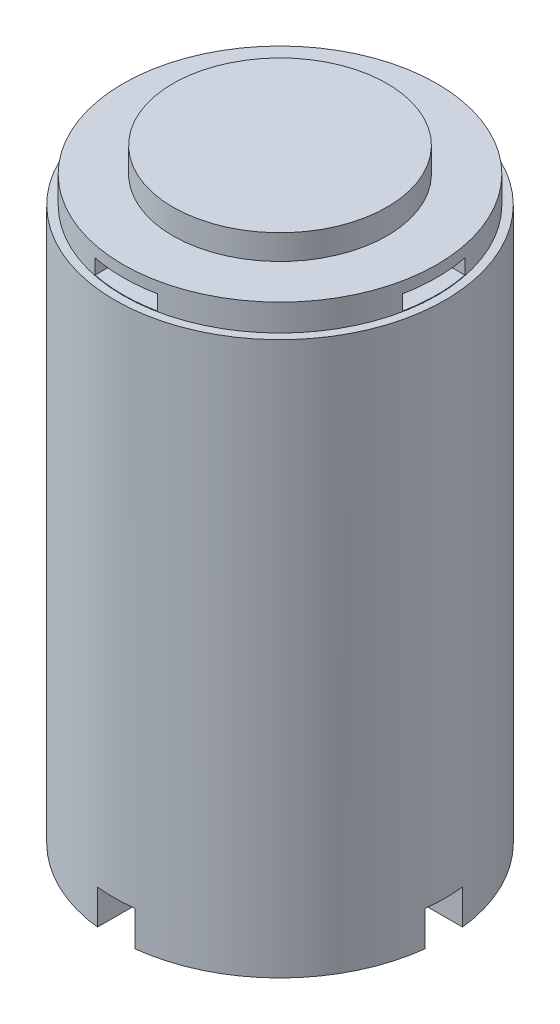
ISO-10303-21;
HEADER;
FILE_DESCRIPTION(('STEP AP214'),'2;1');
FILE_NAME('part.step','',(''),(''),'','','');
FILE_SCHEMA(('AUTOMOTIVE_DESIGN { 1 0 10303 214 1 1 1 1 }'));
ENDSEC;
DATA;
#1=APPLICATION_CONTEXT('core data for automotive mechanical design processes');
#2=APPLICATION_PROTOCOL_DEFINITION('international standard','automotive_design',2000,#1);
#3=PRODUCT_CONTEXT('',#1,'mechanical');
#4=PRODUCT('Part','Part','',(#3));
#5=PRODUCT_RELATED_PRODUCT_CATEGORY('part','',(#4));
#6=PRODUCT_DEFINITION_FORMATION('','',#4);
#7=PRODUCT_DEFINITION_CONTEXT('part definition',#1,'design');
#8=PRODUCT_DEFINITION('design','',#6,#7);
#9=PRODUCT_DEFINITION_SHAPE('','',#8);
#10=(LENGTH_UNIT() NAMED_UNIT(*) SI_UNIT(.MILLI.,.METRE.));
#11=(NAMED_UNIT(*) PLANE_ANGLE_UNIT() SI_UNIT($,.RADIAN.));
#12=(NAMED_UNIT(*) SI_UNIT($,.STERADIAN.) SOLID_ANGLE_UNIT());
#13=UNCERTAINTY_MEASURE_WITH_UNIT(LENGTH_MEASURE(1.E-05),#10,'distance_accuracy_value','');
#14=(GEOMETRIC_REPRESENTATION_CONTEXT(3) GLOBAL_UNCERTAINTY_ASSIGNED_CONTEXT((#13)) GLOBAL_UNIT_ASSIGNED_CONTEXT((#10,
#11,#12)) REPRESENTATION_CONTEXT('',''));
#15=CARTESIAN_POINT('',(0.,0.,0.));
#16=DIRECTION('',(0.,0.,1.));
#17=DIRECTION('',(1.,0.,0.));
#18=AXIS2_PLACEMENT_3D('',#15,#16,#17);
#19=CARTESIAN_POINT('',(1682.75,5594.35,-317.5));
#20=DIRECTION('',(0.,0.,-1.));
#21=DIRECTION('',(-1.,0.,0.));
#22=AXIS2_PLACEMENT_3D('',#19,#20,#21);
#23=PLANE('',#22);
#24=DIRECTION('',(-1.,0.,0.));
#25=VECTOR('',#24,1.);
#26=CARTESIAN_POINT('',(1682.75,5594.35,-317.5));
#27=LINE('',#26,#25);
#28=CARTESIAN_POINT('',(-317.499999999999,5594.35,-317.5));
#29=VERTEX_POINT('',#28);
#30=CARTESIAN_POINT('',(-1568.38572742805,5594.35,-317.5));
#31=VERTEX_POINT('',#30);
#32=EDGE_CURVE('E400',#29,#31,#27,.T.);
#33=ORIENTED_EDGE('',*,*,#32,.F.);
#34=DIRECTION('',(0.,1.,0.));
#35=VECTOR('',#34,1.);
#36=CARTESIAN_POINT('',(-317.500000000001,5594.35,-317.5));
#37=LINE('',#36,#35);
#38=CARTESIAN_POINT('',(-317.500000000001,5746.75,-317.5));
#39=VERTEX_POINT('',#38);
#40=EDGE_CURVE('E397',#29,#39,#37,.T.);
#41=ORIENTED_EDGE('',*,*,#40,.T.);
#42=DIRECTION('',(-1.,0.,0.));
#43=VECTOR('',#42,1.);
#44=CARTESIAN_POINT('',(1682.75,5746.75,-317.5));
#45=LINE('',#44,#43);
#46=CARTESIAN_POINT('',(-1568.38572742805,5746.75,-317.5));
#47=VERTEX_POINT('',#46);
#48=EDGE_CURVE('E405',#39,#47,#45,.T.);
#49=ORIENTED_EDGE('',*,*,#48,.T.);
#50=DIRECTION('',(0.,-1.,0.));
#51=VECTOR('',#50,1.);
#52=CARTESIAN_POINT('',(-1568.38572742805,5861.05,-317.5));
#53=LINE('',#52,#51);
#54=EDGE_CURVE('E495',#31,#47,#53,.F.);
#55=ORIENTED_EDGE('',*,*,#54,.F.);
#56=EDGE_LOOP('',(#33,#41,#49,#55));
#57=FACE_BOUND('',#56,.T.);
#58=ADVANCED_FACE('F42',(#57),#23,.F.);
#59=CARTESIAN_POINT('',(1682.75,5594.35,317.5));
#60=DIRECTION('',(0.,0.,1.));
#61=DIRECTION('',(1.,0.,0.));
#62=AXIS2_PLACEMENT_3D('',#59,#60,#61);
#63=PLANE('',#62);
#64=DIRECTION('',(-1.,0.,0.));
#65=VECTOR('',#64,1.);
#66=CARTESIAN_POINT('',(1682.75,5746.75,317.5));
#67=LINE('',#66,#65);
#68=CARTESIAN_POINT('',(-317.499999999999,5746.75,317.5));
#69=VERTEX_POINT('',#68);
#70=CARTESIAN_POINT('',(-1568.38572742805,5746.75,317.5));
#71=VERTEX_POINT('',#70);
#72=EDGE_CURVE('E409',#69,#71,#67,.T.);
#73=ORIENTED_EDGE('',*,*,#72,.F.);
#74=DIRECTION('',(0.,-1.,0.));
#75=VECTOR('',#74,1.);
#76=CARTESIAN_POINT('',(-317.499999999999,5594.35,317.5));
#77=LINE('',#76,#75);
#78=CARTESIAN_POINT('',(-317.499999999999,5594.35,317.5));
#79=VERTEX_POINT('',#78);
#80=EDGE_CURVE('E394',#69,#79,#77,.T.);
#81=ORIENTED_EDGE('',*,*,#80,.T.);
#82=DIRECTION('',(-1.,0.,0.));
#83=VECTOR('',#82,1.);
#84=CARTESIAN_POINT('',(1682.75,5594.35,317.5));
#85=LINE('',#84,#83);
#86=CARTESIAN_POINT('',(-1568.38572742805,5594.35,317.5));
#87=VERTEX_POINT('',#86);
#88=EDGE_CURVE('E413',#79,#87,#85,.T.);
#89=ORIENTED_EDGE('',*,*,#88,.T.);
#90=DIRECTION('',(0.,-1.,0.));
#91=VECTOR('',#90,1.);
#92=CARTESIAN_POINT('',(-1568.38572742805,5861.05,317.5));
#93=LINE('',#92,#91);
#94=EDGE_CURVE('E488',#71,#87,#93,.T.);
#95=ORIENTED_EDGE('',*,*,#94,.F.);
#96=EDGE_LOOP('',(#73,#81,#89,#95));
#97=FACE_BOUND('',#96,.T.);
#98=ADVANCED_FACE('F537',(#97),#63,.F.);
#99=CARTESIAN_POINT('',(1682.75,0.,-190.5));
#100=DIRECTION('',(0.,0.,-1.));
#101=DIRECTION('',(0.,1.,0.));
#102=AXIS2_PLACEMENT_3D('',#99,#100,#101);
#103=PLANE('',#102);
#104=DIRECTION('',(-1.,0.,0.));
#105=VECTOR('',#104,1.);
#106=CARTESIAN_POINT('',(0.,0.,-190.5));
#107=LINE('',#106,#105);
#108=CARTESIAN_POINT('',(-190.500000000001,0.,-190.5));
#109=VERTEX_POINT('',#108);
#110=CARTESIAN_POINT('',(-1294.15430301027,0.,-190.5));
#111=VERTEX_POINT('',#110);
#112=EDGE_CURVE('E57',#109,#111,#107,.T.);
#113=ORIENTED_EDGE('',*,*,#112,.F.);
#114=DIRECTION('',(0.,1.,0.));
#115=VECTOR('',#114,1.);
#116=CARTESIAN_POINT('',(-190.500000000001,6.82324567217547E-13,-190.5));
#117=LINE('',#116,#115);
#118=CARTESIAN_POINT('',(-190.500000000001,304.8,-190.5));
#119=VERTEX_POINT('',#118);
#120=EDGE_CURVE('E438',#109,#119,#117,.T.);
#121=ORIENTED_EDGE('',*,*,#120,.T.);
#122=DIRECTION('',(-1.,0.,0.));
#123=VECTOR('',#122,1.);
#124=CARTESIAN_POINT('',(1682.75,304.8,-190.5));
#125=LINE('',#124,#123);
#126=CARTESIAN_POINT('',(-1671.93220930156,304.8,-190.5));
#127=VERTEX_POINT('',#126);
#128=EDGE_CURVE('E446',#119,#127,#125,.T.);
#129=ORIENTED_EDGE('',*,*,#128,.T.);
#130=DIRECTION('',(0.,-1.,0.));
#131=VECTOR('',#130,1.);
#132=CARTESIAN_POINT('',(-1671.93220930156,5588.,-190.499999999998));
#133=LINE('',#132,#131);
#134=CARTESIAN_POINT('',(-1671.93220930156,-50.8,-190.5));
#135=VERTEX_POINT('',#134);
#136=EDGE_CURVE('E454',#135,#127,#133,.F.);
#137=ORIENTED_EDGE('',*,*,#136,.F.);
#138=DIRECTION('',(-1.,0.,0.));
#139=VECTOR('',#138,1.);
#140=CARTESIAN_POINT('',(-1671.93220930156,-50.8,-190.5));
#141=LINE('',#140,#139);
#142=CARTESIAN_POINT('',(-1294.15430301027,-50.8,-190.5));
#143=VERTEX_POINT('',#142);
#144=EDGE_CURVE('E279',#143,#135,#141,.T.);
#145=ORIENTED_EDGE('',*,*,#144,.F.);
#146=DIRECTION('',(0.,1.,0.));
#147=VECTOR('',#146,1.);
#148=CARTESIAN_POINT('',(-1294.15430301027,-50.8,-190.5));
#149=LINE('',#148,#147);
#150=EDGE_CURVE('E317',#143,#111,#149,.T.);
#151=ORIENTED_EDGE('',*,*,#150,.T.);
#152=EDGE_LOOP('',(#113,#121,#129,#137,#145,#151));
#153=FACE_BOUND('',#152,.T.);
#154=ADVANCED_FACE('F560',(#153),#103,.F.);
#155=CARTESIAN_POINT('',(1682.75,0.,190.5));
#156=DIRECTION('',(0.,0.,1.));
#157=DIRECTION('',(0.,-1.,0.));
#158=AXIS2_PLACEMENT_3D('',#155,#156,#157);
#159=PLANE('',#158);
#160=DIRECTION('',(-1.,0.,0.));
#161=VECTOR('',#160,1.);
#162=CARTESIAN_POINT('',(1682.75,304.8,190.5));
#163=LINE('',#162,#161);
#164=CARTESIAN_POINT('',(-190.499999999999,304.8,190.5));
#165=VERTEX_POINT('',#164);
#166=CARTESIAN_POINT('',(-1671.93220930156,304.8,190.5));
#167=VERTEX_POINT('',#166);
#168=EDGE_CURVE('E441',#165,#167,#163,.T.);
#169=ORIENTED_EDGE('',*,*,#168,.F.);
#170=DIRECTION('',(0.,-1.,0.));
#171=VECTOR('',#170,1.);
#172=CARTESIAN_POINT('',(-190.499999999999,6.82324567217542E-13,190.5));
#173=LINE('',#172,#171);
#174=CARTESIAN_POINT('',(-190.499999999999,0.,190.5));
#175=VERTEX_POINT('',#174);
#176=EDGE_CURVE('E483',#165,#175,#173,.T.);
#177=ORIENTED_EDGE('',*,*,#176,.T.);
#178=DIRECTION('',(1.,0.,0.));
#179=VECTOR('',#178,1.);
#180=CARTESIAN_POINT('',(1682.75,0.,190.5));
#181=LINE('',#180,#179);
#182=CARTESIAN_POINT('',(-1294.15430301027,0.,190.5));
#183=VERTEX_POINT('',#182);
#184=EDGE_CURVE('E65',#183,#175,#181,.T.);
#185=ORIENTED_EDGE('',*,*,#184,.F.);
#186=DIRECTION('',(0.,1.,0.));
#187=VECTOR('',#186,1.);
#188=CARTESIAN_POINT('',(-1294.15430301027,-50.8,190.500000000001));
#189=LINE('',#188,#187);
#190=CARTESIAN_POINT('',(-1294.15430301027,-50.8,190.500000000001));
#191=VERTEX_POINT('',#190);
#192=EDGE_CURVE('E328',#191,#183,#189,.T.);
#193=ORIENTED_EDGE('',*,*,#192,.F.);
#194=DIRECTION('',(1.,0.,0.));
#195=VECTOR('',#194,1.);
#196=CARTESIAN_POINT('',(-1671.93220930156,-50.8,190.5));
#197=LINE('',#196,#195);
#198=CARTESIAN_POINT('',(-1671.93220930156,-50.8,190.5));
#199=VERTEX_POINT('',#198);
#200=EDGE_CURVE('E312',#199,#191,#197,.T.);
#201=ORIENTED_EDGE('',*,*,#200,.F.);
#202=DIRECTION('',(0.,-1.,0.));
#203=VECTOR('',#202,1.);
#204=CARTESIAN_POINT('',(-1671.93220930156,5588.,190.499999999998));
#205=LINE('',#204,#203);
#206=EDGE_CURVE('E452',#167,#199,#205,.T.);
#207=ORIENTED_EDGE('',*,*,#206,.F.);
#208=EDGE_LOOP('',(#169,#177,#185,#193,#201,#207));
#209=FACE_BOUND('',#208,.T.);
#210=ADVANCED_FACE('F589',(#209),#159,.F.);
#211=CARTESIAN_POINT('',(0.,5588.,0.));
#212=DIRECTION('',(0.,-1.,0.));
#213=DIRECTION('',(0.,0.,-1.));
#214=AXIS2_PLACEMENT_3D('',#211,#212,#213);
#215=CYLINDRICAL_SURFACE('',#214,1682.75);
#216=CARTESIAN_POINT('',(0.,5588.,0.));
#217=DIRECTION('',(0.,1.,0.));
#218=DIRECTION('',(0.,0.,1.));
#219=AXIS2_PLACEMENT_3D('',#216,#217,#218);
#220=CIRCLE('',#219,1682.75);
#221=CARTESIAN_POINT('',(0.,5588.,1682.75));
#222=VERTEX_POINT('',#221);
#223=EDGE_CURVE('E469',#222,#222,#220,.T.);
#224=ORIENTED_EDGE('',*,*,#223,.F.);
#225=EDGE_LOOP('',(#224));
#226=FACE_BOUND('',#225,.T.);
#227=ORIENTED_EDGE('',*,*,#206,.T.);
#228=CARTESIAN_POINT('',(0.,-50.8,0.));
#229=DIRECTION('',(0.,-1.,0.));
#230=DIRECTION('',(0.,0.,-1.));
#231=AXIS2_PLACEMENT_3D('',#228,#229,#230);
#232=CIRCLE('',#231,1682.75);
#233=CARTESIAN_POINT('',(-190.499999999994,-50.8,1671.93220930156));
#234=VERTEX_POINT('',#233);
#235=EDGE_CURVE('E309',#234,#199,#232,.T.);
#236=ORIENTED_EDGE('',*,*,#235,.F.);
#237=DIRECTION('',(0.,-1.,0.));
#238=VECTOR('',#237,1.);
#239=CARTESIAN_POINT('',(-190.499999999992,5588.,1671.93220930156));
#240=LINE('',#239,#238);
#241=CARTESIAN_POINT('',(-190.499999999994,304.8,1671.93220930156));
#242=VERTEX_POINT('',#241);
#243=EDGE_CURVE('E432',#234,#242,#240,.F.);
#244=ORIENTED_EDGE('',*,*,#243,.T.);
#245=CARTESIAN_POINT('',(0.,304.8,0.));
#246=DIRECTION('',(0.,1.,0.));
#247=DIRECTION('',(1.,0.,0.));
#248=AXIS2_PLACEMENT_3D('',#245,#246,#247);
#249=CIRCLE('',#248,1682.75);
#250=CARTESIAN_POINT('',(190.500000000006,304.8,1671.93220930156));
#251=VERTEX_POINT('',#250);
#252=EDGE_CURVE('E426',#242,#251,#249,.T.);
#253=ORIENTED_EDGE('',*,*,#252,.T.);
#254=DIRECTION('',(0.,-1.,0.));
#255=VECTOR('',#254,1.);
#256=CARTESIAN_POINT('',(190.500000000004,5588.,1671.93220930156));
#257=LINE('',#256,#255);
#258=CARTESIAN_POINT('',(190.500000000006,-50.8,1671.93220930156));
#259=VERTEX_POINT('',#258);
#260=EDGE_CURVE('E424',#251,#259,#257,.T.);
#261=ORIENTED_EDGE('',*,*,#260,.T.);
#262=CARTESIAN_POINT('',(0.,-50.8,0.));
#263=DIRECTION('',(0.,-1.,0.));
#264=DIRECTION('',(0.,0.,-1.));
#265=AXIS2_PLACEMENT_3D('',#262,#263,#264);
#266=CIRCLE('',#265,1682.75);
#267=CARTESIAN_POINT('',(1671.93220930156,-50.8,190.5));
#268=VERTEX_POINT('',#267);
#269=EDGE_CURVE('E299',#268,#259,#266,.T.);
#270=ORIENTED_EDGE('',*,*,#269,.F.);
#271=DIRECTION('',(0.,-1.,0.));
#272=VECTOR('',#271,1.);
#273=CARTESIAN_POINT('',(1671.93220930156,5588.,190.499999999998));
#274=LINE('',#273,#272);
#275=CARTESIAN_POINT('',(1671.93220930156,304.8,190.5));
#276=VERTEX_POINT('',#275);
#277=EDGE_CURVE('E445',#268,#276,#274,.F.);
#278=ORIENTED_EDGE('',*,*,#277,.T.);
#279=CARTESIAN_POINT('',(0.,304.8,0.));
#280=DIRECTION('',(0.,1.,0.));
#281=DIRECTION('',(0.,0.,1.));
#282=AXIS2_PLACEMENT_3D('',#279,#280,#281);
#283=CIRCLE('',#282,1682.75);
#284=CARTESIAN_POINT('',(1671.93220930156,304.8,-190.5));
#285=VERTEX_POINT('',#284);
#286=EDGE_CURVE('E479',#276,#285,#283,.T.);
#287=ORIENTED_EDGE('',*,*,#286,.T.);
#288=DIRECTION('',(0.,-1.,0.));
#289=VECTOR('',#288,1.);
#290=CARTESIAN_POINT('',(1671.93220930156,5588.,-190.499999999998));
#291=LINE('',#290,#289);
#292=CARTESIAN_POINT('',(1671.93220930156,-50.8,-190.5));
#293=VERTEX_POINT('',#292);
#294=EDGE_CURVE('E456',#285,#293,#291,.T.);
#295=ORIENTED_EDGE('',*,*,#294,.T.);
#296=CARTESIAN_POINT('',(0.,-50.8,0.));
#297=DIRECTION('',(0.,-1.,0.));
#298=DIRECTION('',(0.,0.,-1.));
#299=AXIS2_PLACEMENT_3D('',#296,#297,#298);
#300=CIRCLE('',#299,1682.75);
#301=CARTESIAN_POINT('',(190.499999999994,-50.8,-1671.93220930156));
#302=VERTEX_POINT('',#301);
#303=EDGE_CURVE('E289',#302,#293,#300,.T.);
#304=ORIENTED_EDGE('',*,*,#303,.F.);
#305=DIRECTION('',(0.,-1.,0.));
#306=VECTOR('',#305,1.);
#307=CARTESIAN_POINT('',(190.499999999992,5588.,-1671.93220930156));
#308=LINE('',#307,#306);
#309=CARTESIAN_POINT('',(190.499999999994,304.8,-1671.93220930156));
#310=VERTEX_POINT('',#309);
#311=EDGE_CURVE('E404',#302,#310,#308,.F.);
#312=ORIENTED_EDGE('',*,*,#311,.T.);
#313=CARTESIAN_POINT('',(-190.500000000006,304.8,-1671.93220930156));
#314=VERTEX_POINT('',#313);
#315=EDGE_CURVE('E262',#310,#314,#249,.T.);
#316=ORIENTED_EDGE('',*,*,#315,.T.);
#317=DIRECTION('',(0.,-1.,0.));
#318=VECTOR('',#317,1.);
#319=CARTESIAN_POINT('',(-190.500000000004,5588.,-1671.93220930156));
#320=LINE('',#319,#318);
#321=CARTESIAN_POINT('',(-190.500000000006,-50.8,-1671.93220930156));
#322=VERTEX_POINT('',#321);
#323=EDGE_CURVE('E255',#314,#322,#320,.T.);
#324=ORIENTED_EDGE('',*,*,#323,.T.);
#325=CARTESIAN_POINT('',(0.,-50.8,0.));
#326=DIRECTION('',(0.,-1.,0.));
#327=DIRECTION('',(0.,0.,-1.));
#328=AXIS2_PLACEMENT_3D('',#325,#326,#327);
#329=CIRCLE('',#328,1682.75);
#330=EDGE_CURVE('E259',#135,#322,#329,.T.);
#331=ORIENTED_EDGE('',*,*,#330,.F.);
#332=ORIENTED_EDGE('',*,*,#136,.T.);
#333=EDGE_CURVE('E476',#127,#167,#283,.T.);
#334=ORIENTED_EDGE('',*,*,#333,.T.);
#335=EDGE_LOOP('',(#227,#236,#244,#253,#261,#270,#278,#287,#295,#304,#312,#316,#324,#331,#332,#334));
#336=FACE_BOUND('',#335,.T.);
#337=ADVANCED_FACE('F44',(#226,#336),#215,.T.);
#338=CARTESIAN_POINT('',(0.,5588.,0.));
#339=DIRECTION('',(0.,1.,0.));
#340=DIRECTION('',(0.,0.,1.));
#341=AXIS2_PLACEMENT_3D('',#338,#339,#340);
#342=PLANE('',#341);
#343=CARTESIAN_POINT('',(0.,5588.,0.));
#344=DIRECTION('',(0.,1.,0.));
#345=DIRECTION('',(0.,0.,1.));
#346=AXIS2_PLACEMENT_3D('',#343,#344,#345);
#347=CIRCLE('',#346,1600.2);
#348=CARTESIAN_POINT('',(0.,5588.,1600.2));
#349=VERTEX_POINT('',#348);
#350=EDGE_CURVE('E466',#349,#349,#347,.T.);
#351=ORIENTED_EDGE('',*,*,#350,.F.);
#352=EDGE_LOOP('',(#351));
#353=FACE_BOUND('',#352,.T.);
#354=ORIENTED_EDGE('',*,*,#223,.T.);
#355=EDGE_LOOP('',(#354));
#356=FACE_BOUND('',#355,.T.);
#357=ADVANCED_FACE('F719',(#353,#356),#342,.T.);
#358=CARTESIAN_POINT('',(0.,5861.05,0.));
#359=DIRECTION('',(0.,-1.,0.));
#360=DIRECTION('',(0.,0.,-1.));
#361=AXIS2_PLACEMENT_3D('',#358,#359,#360);
#362=CYLINDRICAL_SURFACE('',#361,1600.2);
#363=CARTESIAN_POINT('',(0.,5594.35,0.));
#364=DIRECTION('',(0.,-1.,0.));
#365=DIRECTION('',(-1.,0.,0.));
#366=AXIS2_PLACEMENT_3D('',#363,#364,#365);
#367=CIRCLE('',#366,1600.2);
#368=CARTESIAN_POINT('',(317.500000000005,5594.35,1568.38572742804));
#369=VERTEX_POINT('',#368);
#370=CARTESIAN_POINT('',(-317.499999999994,5594.35,1568.38572742805));
#371=VERTEX_POINT('',#370);
#372=EDGE_CURVE('E355',#369,#371,#367,.T.);
#373=ORIENTED_EDGE('',*,*,#372,.T.);
#374=DIRECTION('',(0.,-1.,0.));
#375=VECTOR('',#374,1.);
#376=CARTESIAN_POINT('',(-317.499999999994,5861.05,1568.38572742805));
#377=LINE('',#376,#375);
#378=CARTESIAN_POINT('',(-317.499999999994,5746.75,1568.38572742805));
#379=VERTEX_POINT('',#378);
#380=EDGE_CURVE('E382',#371,#379,#377,.F.);
#381=ORIENTED_EDGE('',*,*,#380,.T.);
#382=CARTESIAN_POINT('',(0.,5746.75,0.));
#383=DIRECTION('',(0.,1.,0.));
#384=DIRECTION('',(1.,0.,0.));
#385=AXIS2_PLACEMENT_3D('',#382,#383,#384);
#386=CIRCLE('',#385,1600.2);
#387=CARTESIAN_POINT('',(317.500000000006,5746.75,1568.38572742804));
#388=VERTEX_POINT('',#387);
#389=EDGE_CURVE('E375',#379,#388,#386,.T.);
#390=ORIENTED_EDGE('',*,*,#389,.T.);
#391=DIRECTION('',(0.,-1.,0.));
#392=VECTOR('',#391,1.);
#393=CARTESIAN_POINT('',(317.500000000006,5861.05,1568.38572742804));
#394=LINE('',#393,#392);
#395=EDGE_CURVE('E372',#388,#369,#394,.T.);
#396=ORIENTED_EDGE('',*,*,#395,.T.);
#397=EDGE_LOOP('',(#373,#381,#390,#396));
#398=FACE_BOUND('',#397,.T.);
#399=CARTESIAN_POINT('',(317.499999999994,5746.75,-1568.38572742805));
#400=VERTEX_POINT('',#399);
#401=CARTESIAN_POINT('',(-317.500000000005,5746.75,-1568.38572742804));
#402=VERTEX_POINT('',#401);
#403=EDGE_CURVE('E379',#400,#402,#386,.T.);
#404=ORIENTED_EDGE('',*,*,#403,.T.);
#405=DIRECTION('',(0.,-1.,0.));
#406=VECTOR('',#405,1.);
#407=CARTESIAN_POINT('',(-317.500000000006,5861.05,-1568.38572742804));
#408=LINE('',#407,#406);
#409=CARTESIAN_POINT('',(-317.500000000005,5594.35,-1568.38572742804));
#410=VERTEX_POINT('',#409);
#411=EDGE_CURVE('E385',#402,#410,#408,.T.);
#412=ORIENTED_EDGE('',*,*,#411,.T.);
#413=CARTESIAN_POINT('',(317.499999999994,5594.35,-1568.38572742805));
#414=VERTEX_POINT('',#413);
#415=EDGE_CURVE('E358',#410,#414,#367,.T.);
#416=ORIENTED_EDGE('',*,*,#415,.T.);
#417=DIRECTION('',(0.,-1.,0.));
#418=VECTOR('',#417,1.);
#419=CARTESIAN_POINT('',(317.499999999994,5861.05,-1568.38572742805));
#420=LINE('',#419,#418);
#421=EDGE_CURVE('E369',#414,#400,#420,.F.);
#422=ORIENTED_EDGE('',*,*,#421,.T.);
#423=EDGE_LOOP('',(#404,#412,#416,#422));
#424=FACE_BOUND('',#423,.T.);
#425=CARTESIAN_POINT('',(0.,5746.75,0.));
#426=DIRECTION('',(0.,1.,0.));
#427=DIRECTION('',(0.,0.,1.));
#428=AXIS2_PLACEMENT_3D('',#425,#426,#427);
#429=CIRCLE('',#428,1600.2);
#430=CARTESIAN_POINT('',(1568.38572742805,5746.75,317.5));
#431=VERTEX_POINT('',#430);
#432=CARTESIAN_POINT('',(1568.38572742805,5746.75,-317.5));
#433=VERTEX_POINT('',#432);
#434=EDGE_CURVE('E50',#431,#433,#429,.T.);
#435=ORIENTED_EDGE('',*,*,#434,.T.);
#436=DIRECTION('',(0.,-1.,0.));
#437=VECTOR('',#436,1.);
#438=CARTESIAN_POINT('',(1568.38572742805,5861.05,-317.5));
#439=LINE('',#438,#437);
#440=CARTESIAN_POINT('',(1568.38572742805,5594.35,-317.5));
#441=VERTEX_POINT('',#440);
#442=EDGE_CURVE('E11',#433,#441,#439,.T.);
#443=ORIENTED_EDGE('',*,*,#442,.T.);
#444=CARTESIAN_POINT('',(0.,5594.35,0.));
#445=DIRECTION('',(0.,-1.,0.));
#446=DIRECTION('',(0.,0.,-1.));
#447=AXIS2_PLACEMENT_3D('',#444,#445,#446);
#448=CIRCLE('',#447,1600.2);
#449=CARTESIAN_POINT('',(1568.38572742805,5594.35,317.5));
#450=VERTEX_POINT('',#449);
#451=EDGE_CURVE('E489',#441,#450,#448,.T.);
#452=ORIENTED_EDGE('',*,*,#451,.T.);
#453=DIRECTION('',(0.,-1.,0.));
#454=VECTOR('',#453,1.);
#455=CARTESIAN_POINT('',(1568.38572742805,5861.05,317.5));
#456=LINE('',#455,#454);
#457=EDGE_CURVE('E497',#450,#431,#456,.F.);
#458=ORIENTED_EDGE('',*,*,#457,.T.);
#459=EDGE_LOOP('',(#435,#443,#452,#458));
#460=FACE_BOUND('',#459,.T.);
#461=EDGE_CURVE('E485',#87,#31,#448,.T.);
#462=ORIENTED_EDGE('',*,*,#461,.T.);
#463=ORIENTED_EDGE('',*,*,#54,.T.);
#464=EDGE_CURVE('E492',#47,#71,#429,.T.);
#465=ORIENTED_EDGE('',*,*,#464,.T.);
#466=ORIENTED_EDGE('',*,*,#94,.T.);
#467=EDGE_LOOP('',(#462,#463,#465,#466));
#468=FACE_BOUND('',#467,.T.);
#469=CARTESIAN_POINT('',(0.,5861.05,0.));
#470=DIRECTION('',(0.,1.,0.));
#471=DIRECTION('',(0.,0.,1.));
#472=AXIS2_PLACEMENT_3D('',#469,#470,#471);
#473=CIRCLE('',#472,1600.2);
#474=CARTESIAN_POINT('',(0.,5861.05,1600.2));
#475=VERTEX_POINT('',#474);
#476=EDGE_CURVE('E461',#475,#475,#473,.T.);
#477=ORIENTED_EDGE('',*,*,#476,.F.);
#478=EDGE_LOOP('',(#477));
#479=FACE_BOUND('',#478,.T.);
#480=ORIENTED_EDGE('',*,*,#350,.T.);
#481=EDGE_LOOP('',(#480));
#482=FACE_BOUND('',#481,.T.);
#483=ADVANCED_FACE('F503',(#398,#424,#460,#468,#479,#482),#362,.T.);
#484=CARTESIAN_POINT('',(0.,5861.05,0.));
#485=DIRECTION('',(0.,1.,0.));
#486=DIRECTION('',(0.,0.,1.));
#487=AXIS2_PLACEMENT_3D('',#484,#485,#486);
#488=PLANE('',#487);
#489=CARTESIAN_POINT('',(0.,5861.05,0.));
#490=DIRECTION('',(0.,1.,0.));
#491=DIRECTION('',(0.,0.,1.));
#492=AXIS2_PLACEMENT_3D('',#489,#490,#491);
#493=CIRCLE('',#492,1092.2);
#494=CARTESIAN_POINT('',(0.,5861.05,1092.2));
#495=VERTEX_POINT('',#494);
#496=EDGE_CURVE('E462',#495,#495,#493,.T.);
#497=ORIENTED_EDGE('',*,*,#496,.F.);
#498=EDGE_LOOP('',(#497));
#499=FACE_BOUND('',#498,.T.);
#500=ORIENTED_EDGE('',*,*,#476,.T.);
#501=EDGE_LOOP('',(#500));
#502=FACE_BOUND('',#501,.T.);
#503=ADVANCED_FACE('F903',(#499,#502),#488,.T.);
#504=CARTESIAN_POINT('',(0.,6115.05,0.));
#505=DIRECTION('',(0.,-1.,0.));
#506=DIRECTION('',(0.,0.,-1.));
#507=AXIS2_PLACEMENT_3D('',#504,#505,#506);
#508=CYLINDRICAL_SURFACE('',#507,1092.2);
#509=CARTESIAN_POINT('',(0.,6115.05,0.));
#510=DIRECTION('',(0.,1.,0.));
#511=DIRECTION('',(0.,0.,1.));
#512=AXIS2_PLACEMENT_3D('',#509,#510,#511);
#513=CIRCLE('',#512,1092.2);
#514=CARTESIAN_POINT('',(0.,6115.05,1092.2));
#515=VERTEX_POINT('',#514);
#516=EDGE_CURVE('E458',#515,#515,#513,.T.);
#517=ORIENTED_EDGE('',*,*,#516,.F.);
#518=EDGE_LOOP('',(#517));
#519=FACE_BOUND('',#518,.T.);
#520=ORIENTED_EDGE('',*,*,#496,.T.);
#521=EDGE_LOOP('',(#520));
#522=FACE_BOUND('',#521,.T.);
#523=ADVANCED_FACE('F893',(#519,#522),#508,.T.);
#524=CARTESIAN_POINT('',(0.,6115.05,0.));
#525=DIRECTION('',(0.,1.,0.));
#526=DIRECTION('',(0.,0.,1.));
#527=AXIS2_PLACEMENT_3D('',#524,#525,#526);
#528=PLANE('',#527);
#529=ORIENTED_EDGE('',*,*,#516,.T.);
#530=EDGE_LOOP('',(#529));
#531=FACE_BOUND('',#530,.T.);
#532=ADVANCED_FACE('F885',(#531),#528,.T.);
#533=CARTESIAN_POINT('',(1682.75,304.8,-190.5));
#534=DIRECTION('',(0.,1.,0.));
#535=DIRECTION('',(0.,0.,1.));
#536=AXIS2_PLACEMENT_3D('',#533,#534,#535);
#537=PLANE('',#536);
#538=CARTESIAN_POINT('',(190.500000000001,304.8,190.5));
#539=VERTEX_POINT('',#538);
#540=EDGE_CURVE('E447',#276,#539,#163,.T.);
#541=ORIENTED_EDGE('',*,*,#540,.T.);
#542=DIRECTION('',(0.,0.,1.));
#543=VECTOR('',#542,1.);
#544=CARTESIAN_POINT('',(190.499999999994,304.8,-1682.75));
#545=LINE('',#544,#543);
#546=EDGE_CURVE('E418',#539,#251,#545,.T.);
#547=ORIENTED_EDGE('',*,*,#546,.T.);
#548=ORIENTED_EDGE('',*,*,#252,.F.);
#549=DIRECTION('',(0.,0.,1.));
#550=VECTOR('',#549,1.);
#551=CARTESIAN_POINT('',(-190.500000000006,304.8,-1682.75));
#552=LINE('',#551,#550);
#553=EDGE_CURVE('E429',#165,#242,#552,.T.);
#554=ORIENTED_EDGE('',*,*,#553,.F.);
#555=ORIENTED_EDGE('',*,*,#168,.T.);
#556=ORIENTED_EDGE('',*,*,#333,.F.);
#557=ORIENTED_EDGE('',*,*,#128,.F.);
#558=EDGE_CURVE('E430',#314,#119,#552,.T.);
#559=ORIENTED_EDGE('',*,*,#558,.F.);
#560=ORIENTED_EDGE('',*,*,#315,.F.);
#561=CARTESIAN_POINT('',(190.499999999999,304.8,-190.5));
#562=VERTEX_POINT('',#561);
#563=EDGE_CURVE('E419',#310,#562,#545,.T.);
#564=ORIENTED_EDGE('',*,*,#563,.T.);
#565=EDGE_CURVE('E442',#285,#562,#125,.T.);
#566=ORIENTED_EDGE('',*,*,#565,.F.);
#567=ORIENTED_EDGE('',*,*,#286,.F.);
#568=EDGE_LOOP('',(#541,#547,#548,#554,#555,#556,#557,#559,#560,#564,#566,#567));
#569=FACE_BOUND('',#568,.T.);
#570=ADVANCED_FACE('F606',(#569),#537,.F.);
#571=ORIENTED_EDGE('',*,*,#565,.T.);
#572=DIRECTION('',(0.,-1.,0.));
#573=VECTOR('',#572,1.);
#574=CARTESIAN_POINT('',(190.5,-5.43546689139398E-13,-190.5));
#575=LINE('',#574,#573);
#576=CARTESIAN_POINT('',(190.5,0.,-190.5));
#577=VERTEX_POINT('',#576);
#578=EDGE_CURVE('E264',#562,#577,#575,.T.);
#579=ORIENTED_EDGE('',*,*,#578,.T.);
#580=DIRECTION('',(-1.,0.,0.));
#581=VECTOR('',#580,1.);
#582=CARTESIAN_POINT('',(1682.75,0.,-190.5));
#583=LINE('',#582,#581);
#584=CARTESIAN_POINT('',(1294.15430301027,0.,-190.5));
#585=VERTEX_POINT('',#584);
#586=EDGE_CURVE('E346',#585,#577,#583,.T.);
#587=ORIENTED_EDGE('',*,*,#586,.F.);
#588=DIRECTION('',(0.,1.,0.));
#589=VECTOR('',#588,1.);
#590=CARTESIAN_POINT('',(1294.15430301027,-50.8,-190.5));
#591=LINE('',#590,#589);
#592=CARTESIAN_POINT('',(1294.15430301027,-50.8,-190.5));
#593=VERTEX_POINT('',#592);
#594=EDGE_CURVE('E339',#593,#585,#591,.T.);
#595=ORIENTED_EDGE('',*,*,#594,.F.);
#596=DIRECTION('',(-1.,0.,0.));
#597=VECTOR('',#596,1.);
#598=CARTESIAN_POINT('',(1671.93220930156,-50.8,-190.5));
#599=LINE('',#598,#597);
#600=EDGE_CURVE('E292',#293,#593,#599,.T.);
#601=ORIENTED_EDGE('',*,*,#600,.F.);
#602=ORIENTED_EDGE('',*,*,#294,.F.);
#603=EDGE_LOOP('',(#571,#579,#587,#595,#601,#602));
#604=FACE_BOUND('',#603,.T.);
#605=ADVANCED_FACE('F586',(#604),#103,.F.);
#606=DIRECTION('',(1.,0.,0.));
#607=VECTOR('',#606,1.);
#608=CARTESIAN_POINT('',(0.,0.,190.5));
#609=LINE('',#608,#607);
#610=CARTESIAN_POINT('',(190.500000000001,0.,190.5));
#611=VERTEX_POINT('',#610);
#612=CARTESIAN_POINT('',(1294.15430301027,0.,190.5));
#613=VERTEX_POINT('',#612);
#614=EDGE_CURVE('E465',#611,#613,#609,.T.);
#615=ORIENTED_EDGE('',*,*,#614,.F.);
#616=DIRECTION('',(0.,1.,0.));
#617=VECTOR('',#616,1.);
#618=CARTESIAN_POINT('',(190.500000000001,-5.43546689139401E-13,190.5));
#619=LINE('',#618,#617);
#620=EDGE_CURVE('E480',#611,#539,#619,.T.);
#621=ORIENTED_EDGE('',*,*,#620,.T.);
#622=ORIENTED_EDGE('',*,*,#540,.F.);
#623=ORIENTED_EDGE('',*,*,#277,.F.);
#624=DIRECTION('',(1.,0.,0.));
#625=VECTOR('',#624,1.);
#626=CARTESIAN_POINT('',(1294.15430301027,-50.8,190.5));
#627=LINE('',#626,#625);
#628=CARTESIAN_POINT('',(1294.15430301027,-50.8,190.5));
#629=VERTEX_POINT('',#628);
#630=EDGE_CURVE('E296',#629,#268,#627,.T.);
#631=ORIENTED_EDGE('',*,*,#630,.F.);
#632=DIRECTION('',(0.,1.,0.));
#633=VECTOR('',#632,1.);
#634=CARTESIAN_POINT('',(1294.15430301027,-50.8,190.5));
#635=LINE('',#634,#633);
#636=EDGE_CURVE('E336',#629,#613,#635,.T.);
#637=ORIENTED_EDGE('',*,*,#636,.T.);
#638=EDGE_LOOP('',(#615,#621,#622,#623,#631,#637));
#639=FACE_BOUND('',#638,.T.);
#640=ADVANCED_FACE('F579',(#639),#159,.F.);
#641=CARTESIAN_POINT('',(190.499999999994,0.,-1682.75));
#642=DIRECTION('',(1.,0.,0.));
#643=DIRECTION('',(0.,-1.,0.));
#644=AXIS2_PLACEMENT_3D('',#641,#642,#643);
#645=PLANE('',#644);
#646=DIRECTION('',(0.,0.,-1.));
#647=VECTOR('',#646,1.);
#648=CARTESIAN_POINT('',(190.499999999994,0.,-1682.75));
#649=LINE('',#648,#647);
#650=CARTESIAN_POINT('',(190.500000000005,0.,1294.15430301027));
#651=VERTEX_POINT('',#650);
#652=EDGE_CURVE('E352',#651,#611,#649,.T.);
#653=ORIENTED_EDGE('',*,*,#652,.F.);
#654=DIRECTION('',(0.,1.,0.));
#655=VECTOR('',#654,1.);
#656=CARTESIAN_POINT('',(190.500000000006,-50.8,1294.15430301027));
#657=LINE('',#656,#655);
#658=CARTESIAN_POINT('',(190.500000000006,-50.8,1294.15430301027));
#659=VERTEX_POINT('',#658);
#660=EDGE_CURVE('E333',#659,#651,#657,.T.);
#661=ORIENTED_EDGE('',*,*,#660,.F.);
#662=DIRECTION('',(0.,0.,-1.));
#663=VECTOR('',#662,1.);
#664=CARTESIAN_POINT('',(190.500000000006,-50.8,1294.15430301027));
#665=LINE('',#664,#663);
#666=EDGE_CURVE('E302',#259,#659,#665,.T.);
#667=ORIENTED_EDGE('',*,*,#666,.F.);
#668=ORIENTED_EDGE('',*,*,#260,.F.);
#669=ORIENTED_EDGE('',*,*,#546,.F.);
#670=ORIENTED_EDGE('',*,*,#620,.F.);
#671=EDGE_LOOP('',(#653,#661,#667,#668,#669,#670));
#672=FACE_BOUND('',#671,.T.);
#673=ADVANCED_FACE('F572',(#672),#645,.F.);
#674=CARTESIAN_POINT('',(-190.500000000006,0.,-1682.75));
#675=DIRECTION('',(-1.,0.,0.));
#676=DIRECTION('',(0.,1.,0.));
#677=AXIS2_PLACEMENT_3D('',#674,#675,#676);
#678=PLANE('',#677);
#679=ORIENTED_EDGE('',*,*,#553,.T.);
#680=ORIENTED_EDGE('',*,*,#243,.F.);
#681=DIRECTION('',(0.,0.,1.));
#682=VECTOR('',#681,1.);
#683=CARTESIAN_POINT('',(-190.499999999994,-50.8,1671.93220930156));
#684=LINE('',#683,#682);
#685=CARTESIAN_POINT('',(-190.499999999994,-50.8,1294.15430301027));
#686=VERTEX_POINT('',#685);
#687=EDGE_CURVE('E306',#686,#234,#684,.T.);
#688=ORIENTED_EDGE('',*,*,#687,.F.);
#689=DIRECTION('',(0.,1.,0.));
#690=VECTOR('',#689,1.);
#691=CARTESIAN_POINT('',(-190.499999999994,-50.8,1294.15430301027));
#692=LINE('',#691,#690);
#693=CARTESIAN_POINT('',(-190.499999999996,0.,1294.15430301027));
#694=VERTEX_POINT('',#693);
#695=EDGE_CURVE('E330',#686,#694,#692,.T.);
#696=ORIENTED_EDGE('',*,*,#695,.T.);
#697=DIRECTION('',(0.,0.,1.));
#698=VECTOR('',#697,1.);
#699=CARTESIAN_POINT('',(-190.5,0.,6.65127195049617E-13));
#700=LINE('',#699,#698);
#701=EDGE_CURVE('E265',#175,#694,#700,.T.);
#702=ORIENTED_EDGE('',*,*,#701,.F.);
#703=ORIENTED_EDGE('',*,*,#176,.F.);
#704=EDGE_LOOP('',(#679,#680,#688,#696,#702,#703));
#705=FACE_BOUND('',#704,.T.);
#706=ADVANCED_FACE('F576',(#705),#678,.F.);
#707=DIRECTION('',(0.,0.,1.));
#708=VECTOR('',#707,1.);
#709=CARTESIAN_POINT('',(-190.500000000006,0.,-1682.75));
#710=LINE('',#709,#708);
#711=CARTESIAN_POINT('',(-190.500000000005,0.,-1294.15430301027));
#712=VERTEX_POINT('',#711);
#713=EDGE_CURVE('E349',#712,#109,#710,.T.);
#714=ORIENTED_EDGE('',*,*,#713,.F.);
#715=DIRECTION('',(0.,1.,0.));
#716=VECTOR('',#715,1.);
#717=CARTESIAN_POINT('',(-190.500000000005,-50.8,-1294.15430301027));
#718=LINE('',#717,#716);
#719=CARTESIAN_POINT('',(-190.500000000005,-50.8,-1294.15430301027));
#720=VERTEX_POINT('',#719);
#721=EDGE_CURVE('E271',#720,#712,#718,.T.);
#722=ORIENTED_EDGE('',*,*,#721,.F.);
#723=DIRECTION('',(0.,0.,1.));
#724=VECTOR('',#723,1.);
#725=CARTESIAN_POINT('',(-190.500000000006,-50.8,-1671.93220930156));
#726=LINE('',#725,#724);
#727=EDGE_CURVE('E268',#322,#720,#726,.T.);
#728=ORIENTED_EDGE('',*,*,#727,.F.);
#729=ORIENTED_EDGE('',*,*,#323,.F.);
#730=ORIENTED_EDGE('',*,*,#558,.T.);
#731=ORIENTED_EDGE('',*,*,#120,.F.);
#732=EDGE_LOOP('',(#714,#722,#728,#729,#730,#731));
#733=FACE_BOUND('',#732,.T.);
#734=ADVANCED_FACE('F269',(#733),#678,.F.);
#735=ORIENTED_EDGE('',*,*,#563,.F.);
#736=ORIENTED_EDGE('',*,*,#311,.F.);
#737=DIRECTION('',(0.,0.,-1.));
#738=VECTOR('',#737,1.);
#739=CARTESIAN_POINT('',(190.499999999994,-50.8,-1671.93220930156));
#740=LINE('',#739,#738);
#741=CARTESIAN_POINT('',(190.499999999996,-50.8,-1294.15430301027));
#742=VERTEX_POINT('',#741);
#743=EDGE_CURVE('E286',#742,#302,#740,.T.);
#744=ORIENTED_EDGE('',*,*,#743,.F.);
#745=DIRECTION('',(0.,1.,0.));
#746=VECTOR('',#745,1.);
#747=CARTESIAN_POINT('',(190.499999999996,-50.8,-1294.15430301027));
#748=LINE('',#747,#746);
#749=CARTESIAN_POINT('',(190.499999999996,0.,-1294.15430301027));
#750=VERTEX_POINT('',#749);
#751=EDGE_CURVE('E342',#742,#750,#748,.T.);
#752=ORIENTED_EDGE('',*,*,#751,.T.);
#753=DIRECTION('',(0.,0.,-1.));
#754=VECTOR('',#753,1.);
#755=CARTESIAN_POINT('',(190.5,0.,-6.65127195049617E-13));
#756=LINE('',#755,#754);
#757=EDGE_CURVE('E422',#577,#750,#756,.T.);
#758=ORIENTED_EDGE('',*,*,#757,.F.);
#759=ORIENTED_EDGE('',*,*,#578,.F.);
#760=EDGE_LOOP('',(#735,#736,#744,#752,#758,#759));
#761=FACE_BOUND('',#760,.T.);
#762=ADVANCED_FACE('F567',(#761),#645,.F.);
#763=CARTESIAN_POINT('',(317.499999999999,5746.75,-317.5));
#764=VERTEX_POINT('',#763);
#765=EDGE_CURVE('E401',#433,#764,#45,.T.);
#766=ORIENTED_EDGE('',*,*,#765,.T.);
#767=DIRECTION('',(0.,-1.,0.));
#768=VECTOR('',#767,1.);
#769=CARTESIAN_POINT('',(317.499999999999,5594.35,-317.5));
#770=LINE('',#769,#768);
#771=CARTESIAN_POINT('',(317.499999999999,5594.35,-317.5));
#772=VERTEX_POINT('',#771);
#773=EDGE_CURVE('E391',#764,#772,#770,.T.);
#774=ORIENTED_EDGE('',*,*,#773,.T.);
#775=EDGE_CURVE('E414',#441,#772,#27,.T.);
#776=ORIENTED_EDGE('',*,*,#775,.F.);
#777=ORIENTED_EDGE('',*,*,#442,.F.);
#778=EDGE_LOOP('',(#766,#774,#776,#777));
#779=FACE_BOUND('',#778,.T.);
#780=ADVANCED_FACE('F510',(#779),#23,.F.);
#781=CARTESIAN_POINT('',(1682.75,5746.75,-317.5));
#782=DIRECTION('',(0.,1.,0.));
#783=DIRECTION('',(0.,0.,1.));
#784=AXIS2_PLACEMENT_3D('',#781,#782,#783);
#785=PLANE('',#784);
#786=CARTESIAN_POINT('',(317.500000000001,5746.75,317.5));
#787=VERTEX_POINT('',#786);
#788=EDGE_CURVE('E406',#431,#787,#67,.T.);
#789=ORIENTED_EDGE('',*,*,#788,.T.);
#790=DIRECTION('',(0.,0.,1.));
#791=VECTOR('',#790,1.);
#792=CARTESIAN_POINT('',(317.499999999994,5746.75,-1682.75));
#793=LINE('',#792,#791);
#794=EDGE_CURVE('E365',#787,#388,#793,.T.);
#795=ORIENTED_EDGE('',*,*,#794,.T.);
#796=ORIENTED_EDGE('',*,*,#389,.F.);
#797=DIRECTION('',(0.,0.,1.));
#798=VECTOR('',#797,1.);
#799=CARTESIAN_POINT('',(-317.500000000006,5746.75,-1682.75));
#800=LINE('',#799,#798);
#801=EDGE_CURVE('E378',#69,#379,#800,.T.);
#802=ORIENTED_EDGE('',*,*,#801,.F.);
#803=ORIENTED_EDGE('',*,*,#72,.T.);
#804=ORIENTED_EDGE('',*,*,#464,.F.);
#805=ORIENTED_EDGE('',*,*,#48,.F.);
#806=EDGE_CURVE('E380',#402,#39,#800,.T.);
#807=ORIENTED_EDGE('',*,*,#806,.F.);
#808=ORIENTED_EDGE('',*,*,#403,.F.);
#809=EDGE_CURVE('E366',#400,#764,#793,.T.);
#810=ORIENTED_EDGE('',*,*,#809,.T.);
#811=ORIENTED_EDGE('',*,*,#765,.F.);
#812=ORIENTED_EDGE('',*,*,#434,.F.);
#813=EDGE_LOOP('',(#789,#795,#796,#802,#803,#804,#805,#807,#808,#810,#811,#812));
#814=FACE_BOUND('',#813,.T.);
#815=ADVANCED_FACE('F516',(#814),#785,.F.);
#816=CARTESIAN_POINT('',(317.5,5594.35,317.5));
#817=VERTEX_POINT('',#816);
#818=EDGE_CURVE('E410',#450,#817,#85,.T.);
#819=ORIENTED_EDGE('',*,*,#818,.T.);
#820=DIRECTION('',(0.,1.,0.));
#821=VECTOR('',#820,1.);
#822=CARTESIAN_POINT('',(317.500000000001,5594.35,317.5));
#823=LINE('',#822,#821);
#824=EDGE_CURVE('E388',#817,#787,#823,.T.);
#825=ORIENTED_EDGE('',*,*,#824,.T.);
#826=ORIENTED_EDGE('',*,*,#788,.F.);
#827=ORIENTED_EDGE('',*,*,#457,.F.);
#828=EDGE_LOOP('',(#819,#825,#826,#827));
#829=FACE_BOUND('',#828,.T.);
#830=ADVANCED_FACE('F550',(#829),#63,.F.);
#831=CARTESIAN_POINT('',(1682.75,5594.35,-317.5));
#832=DIRECTION('',(0.,-1.,0.));
#833=DIRECTION('',(0.,0.,-1.));
#834=AXIS2_PLACEMENT_3D('',#831,#832,#833);
#835=PLANE('',#834);
#836=ORIENTED_EDGE('',*,*,#775,.T.);
#837=DIRECTION('',(0.,0.,1.));
#838=VECTOR('',#837,1.);
#839=CARTESIAN_POINT('',(317.499999999994,5594.35,-1682.75));
#840=LINE('',#839,#838);
#841=EDGE_CURVE('E363',#414,#772,#840,.T.);
#842=ORIENTED_EDGE('',*,*,#841,.F.);
#843=ORIENTED_EDGE('',*,*,#415,.F.);
#844=DIRECTION('',(0.,0.,1.));
#845=VECTOR('',#844,1.);
#846=CARTESIAN_POINT('',(-317.500000000006,5594.35,-1682.75));
#847=LINE('',#846,#845);
#848=EDGE_CURVE('E359',#410,#29,#847,.T.);
#849=ORIENTED_EDGE('',*,*,#848,.T.);
#850=ORIENTED_EDGE('',*,*,#32,.T.);
#851=ORIENTED_EDGE('',*,*,#461,.F.);
#852=ORIENTED_EDGE('',*,*,#88,.F.);
#853=EDGE_CURVE('E362',#79,#371,#847,.T.);
#854=ORIENTED_EDGE('',*,*,#853,.T.);
#855=ORIENTED_EDGE('',*,*,#372,.F.);
#856=EDGE_CURVE('E361',#817,#369,#840,.T.);
#857=ORIENTED_EDGE('',*,*,#856,.F.);
#858=ORIENTED_EDGE('',*,*,#818,.F.);
#859=ORIENTED_EDGE('',*,*,#451,.F.);
#860=EDGE_LOOP('',(#836,#842,#843,#849,#850,#851,#852,#854,#855,#857,#858,#859));
#861=FACE_BOUND('',#860,.T.);
#862=ADVANCED_FACE('F507',(#861),#835,.F.);
#863=CARTESIAN_POINT('',(317.499999999994,5594.35,-1682.75));
#864=DIRECTION('',(1.,0.,0.));
#865=DIRECTION('',(0.,0.,-1.));
#866=AXIS2_PLACEMENT_3D('',#863,#864,#865);
#867=PLANE('',#866);
#868=ORIENTED_EDGE('',*,*,#856,.T.);
#869=ORIENTED_EDGE('',*,*,#395,.F.);
#870=ORIENTED_EDGE('',*,*,#794,.F.);
#871=ORIENTED_EDGE('',*,*,#824,.F.);
#872=EDGE_LOOP('',(#868,#869,#870,#871));
#873=FACE_BOUND('',#872,.T.);
#874=ADVANCED_FACE('F547',(#873),#867,.F.);
#875=CARTESIAN_POINT('',(-317.500000000006,5594.35,-1682.75));
#876=DIRECTION('',(-1.,0.,0.));
#877=DIRECTION('',(0.,0.,1.));
#878=AXIS2_PLACEMENT_3D('',#875,#876,#877);
#879=PLANE('',#878);
#880=ORIENTED_EDGE('',*,*,#801,.T.);
#881=ORIENTED_EDGE('',*,*,#380,.F.);
#882=ORIENTED_EDGE('',*,*,#853,.F.);
#883=ORIENTED_EDGE('',*,*,#80,.F.);
#884=EDGE_LOOP('',(#880,#881,#882,#883));
#885=FACE_BOUND('',#884,.T.);
#886=ADVANCED_FACE('F540',(#885),#879,.F.);
#887=ORIENTED_EDGE('',*,*,#848,.F.);
#888=ORIENTED_EDGE('',*,*,#411,.F.);
#889=ORIENTED_EDGE('',*,*,#806,.T.);
#890=ORIENTED_EDGE('',*,*,#40,.F.);
#891=EDGE_LOOP('',(#887,#888,#889,#890));
#892=FACE_BOUND('',#891,.T.);
#893=ADVANCED_FACE('F525',(#892),#879,.F.);
#894=ORIENTED_EDGE('',*,*,#809,.F.);
#895=ORIENTED_EDGE('',*,*,#421,.F.);
#896=ORIENTED_EDGE('',*,*,#841,.T.);
#897=ORIENTED_EDGE('',*,*,#773,.F.);
#898=EDGE_LOOP('',(#894,#895,#896,#897));
#899=FACE_BOUND('',#898,.T.);
#900=ADVANCED_FACE('F513',(#899),#867,.F.);
#901=CARTESIAN_POINT('',(0.,0.,0.));
#902=DIRECTION('',(0.,-1.,0.));
#903=DIRECTION('',(0.,0.,-1.));
#904=AXIS2_PLACEMENT_3D('',#901,#902,#903);
#905=PLANE('',#904);
#906=ORIENTED_EDGE('',*,*,#652,.T.);
#907=ORIENTED_EDGE('',*,*,#614,.T.);
#908=CARTESIAN_POINT('',(0.,0.,0.));
#909=DIRECTION('',(0.,-1.,0.));
#910=DIRECTION('',(0.,0.,-1.));
#911=AXIS2_PLACEMENT_3D('',#908,#909,#910);
#912=CIRCLE('',#911,1308.1);
#913=EDGE_CURVE('E321',#585,#613,#912,.T.);
#914=ORIENTED_EDGE('',*,*,#913,.F.);
#915=ORIENTED_EDGE('',*,*,#586,.T.);
#916=ORIENTED_EDGE('',*,*,#757,.T.);
#917=CARTESIAN_POINT('',(0.,0.,0.));
#918=DIRECTION('',(0.,-1.,0.));
#919=DIRECTION('',(0.,0.,-1.));
#920=AXIS2_PLACEMENT_3D('',#917,#918,#919);
#921=CIRCLE('',#920,1308.1);
#922=EDGE_CURVE('E318',#712,#750,#921,.T.);
#923=ORIENTED_EDGE('',*,*,#922,.F.);
#924=ORIENTED_EDGE('',*,*,#713,.T.);
#925=ORIENTED_EDGE('',*,*,#112,.T.);
#926=CARTESIAN_POINT('',(0.,0.,0.));
#927=DIRECTION('',(0.,-1.,0.));
#928=DIRECTION('',(0.,0.,-1.));
#929=AXIS2_PLACEMENT_3D('',#926,#927,#928);
#930=CIRCLE('',#929,1308.1);
#931=EDGE_CURVE('E280',#183,#111,#930,.T.);
#932=ORIENTED_EDGE('',*,*,#931,.F.);
#933=ORIENTED_EDGE('',*,*,#184,.T.);
#934=ORIENTED_EDGE('',*,*,#701,.T.);
#935=CARTESIAN_POINT('',(0.,0.,0.));
#936=DIRECTION('',(0.,-1.,0.));
#937=DIRECTION('',(0.,0.,-1.));
#938=AXIS2_PLACEMENT_3D('',#935,#936,#937);
#939=CIRCLE('',#938,1308.1);
#940=EDGE_CURVE('E282',#651,#694,#939,.T.);
#941=ORIENTED_EDGE('',*,*,#940,.F.);
#942=EDGE_LOOP('',(#906,#907,#914,#915,#916,#923,#924,#925,#932,#933,#934,#941));
#943=FACE_BOUND('',#942,.T.);
#944=ADVANCED_FACE('F598',(#943),#905,.F.);
#945=CARTESIAN_POINT('',(0.,-50.8,0.));
#946=DIRECTION('',(0.,1.,0.));
#947=DIRECTION('',(0.,0.,1.));
#948=AXIS2_PLACEMENT_3D('',#945,#946,#947);
#949=CYLINDRICAL_SURFACE('',#948,1308.1);
#950=ORIENTED_EDGE('',*,*,#922,.T.);
#951=ORIENTED_EDGE('',*,*,#751,.F.);
#952=CARTESIAN_POINT('',(0.,-50.8,0.));
#953=DIRECTION('',(0.,-1.,0.));
#954=DIRECTION('',(0.,0.,-1.));
#955=AXIS2_PLACEMENT_3D('',#952,#953,#954);
#956=CIRCLE('',#955,1308.1);
#957=EDGE_CURVE('E274',#720,#742,#956,.T.);
#958=ORIENTED_EDGE('',*,*,#957,.F.);
#959=ORIENTED_EDGE('',*,*,#721,.T.);
#960=EDGE_LOOP('',(#950,#951,#958,#959));
#961=FACE_BOUND('',#960,.T.);
#962=ADVANCED_FACE('F615',(#961),#949,.T.);
#963=CARTESIAN_POINT('',(0.,-50.8,0.));
#964=DIRECTION('',(0.,1.,0.));
#965=DIRECTION('',(0.,0.,1.));
#966=AXIS2_PLACEMENT_3D('',#963,#964,#965);
#967=CYLINDRICAL_SURFACE('',#966,1308.1);
#968=ORIENTED_EDGE('',*,*,#913,.T.);
#969=ORIENTED_EDGE('',*,*,#636,.F.);
#970=CARTESIAN_POINT('',(0.,-50.8,0.));
#971=DIRECTION('',(0.,-1.,0.));
#972=DIRECTION('',(0.,0.,-1.));
#973=AXIS2_PLACEMENT_3D('',#970,#971,#972);
#974=CIRCLE('',#973,1308.1);
#975=EDGE_CURVE('E294',#593,#629,#974,.T.);
#976=ORIENTED_EDGE('',*,*,#975,.F.);
#977=ORIENTED_EDGE('',*,*,#594,.T.);
#978=EDGE_LOOP('',(#968,#969,#976,#977));
#979=FACE_BOUND('',#978,.T.);
#980=ADVANCED_FACE('F627',(#979),#967,.T.);
#981=CARTESIAN_POINT('',(0.,-50.8,0.));
#982=DIRECTION('',(0.,1.,0.));
#983=DIRECTION('',(0.,0.,1.));
#984=AXIS2_PLACEMENT_3D('',#981,#982,#983);
#985=CYLINDRICAL_SURFACE('',#984,1308.1);
#986=ORIENTED_EDGE('',*,*,#940,.T.);
#987=ORIENTED_EDGE('',*,*,#695,.F.);
#988=CARTESIAN_POINT('',(0.,-50.8,0.));
#989=DIRECTION('',(0.,-1.,0.));
#990=DIRECTION('',(0.,0.,-1.));
#991=AXIS2_PLACEMENT_3D('',#988,#989,#990);
#992=CIRCLE('',#991,1308.1);
#993=EDGE_CURVE('E304',#659,#686,#992,.T.);
#994=ORIENTED_EDGE('',*,*,#993,.F.);
#995=ORIENTED_EDGE('',*,*,#660,.T.);
#996=EDGE_LOOP('',(#986,#987,#994,#995));
#997=FACE_BOUND('',#996,.T.);
#998=ADVANCED_FACE('F596',(#997),#985,.T.);
#999=CARTESIAN_POINT('',(0.,-50.8,0.));
#1000=DIRECTION('',(0.,1.,0.));
#1001=DIRECTION('',(0.,0.,1.));
#1002=AXIS2_PLACEMENT_3D('',#999,#1000,#1001);
#1003=CYLINDRICAL_SURFACE('',#1002,1308.1);
#1004=ORIENTED_EDGE('',*,*,#931,.T.);
#1005=ORIENTED_EDGE('',*,*,#150,.F.);
#1006=CARTESIAN_POINT('',(0.,-50.8,0.));
#1007=DIRECTION('',(0.,-1.,0.));
#1008=DIRECTION('',(0.,0.,-1.));
#1009=AXIS2_PLACEMENT_3D('',#1006,#1007,#1008);
#1010=CIRCLE('',#1009,1308.1);
#1011=EDGE_CURVE('E314',#191,#143,#1010,.T.);
#1012=ORIENTED_EDGE('',*,*,#1011,.F.);
#1013=ORIENTED_EDGE('',*,*,#192,.T.);
#1014=EDGE_LOOP('',(#1004,#1005,#1012,#1013));
#1015=FACE_BOUND('',#1014,.T.);
#1016=ADVANCED_FACE('F638',(#1015),#1003,.T.);
#1017=CARTESIAN_POINT('',(0.,-50.8,0.));
#1018=DIRECTION('',(0.,-1.,0.));
#1019=DIRECTION('',(0.,0.,-1.));
#1020=AXIS2_PLACEMENT_3D('',#1017,#1018,#1019);
#1021=PLANE('',#1020);
#1022=ORIENTED_EDGE('',*,*,#330,.T.);
#1023=ORIENTED_EDGE('',*,*,#727,.T.);
#1024=ORIENTED_EDGE('',*,*,#957,.T.);
#1025=ORIENTED_EDGE('',*,*,#743,.T.);
#1026=ORIENTED_EDGE('',*,*,#303,.T.);
#1027=ORIENTED_EDGE('',*,*,#600,.T.);
#1028=ORIENTED_EDGE('',*,*,#975,.T.);
#1029=ORIENTED_EDGE('',*,*,#630,.T.);
#1030=ORIENTED_EDGE('',*,*,#269,.T.);
#1031=ORIENTED_EDGE('',*,*,#666,.T.);
#1032=ORIENTED_EDGE('',*,*,#993,.T.);
#1033=ORIENTED_EDGE('',*,*,#687,.T.);
#1034=ORIENTED_EDGE('',*,*,#235,.T.);
#1035=ORIENTED_EDGE('',*,*,#200,.T.);
#1036=ORIENTED_EDGE('',*,*,#1011,.T.);
#1037=ORIENTED_EDGE('',*,*,#144,.T.);
#1038=EDGE_LOOP('',(#1022,#1023,#1024,#1025,#1026,#1027,#1028,#1029,#1030,#1031,#1032,#1033,
#1034,#1035,#1036,#1037));
#1039=FACE_BOUND('',#1038,.T.);
#1040=ADVANCED_FACE('F277',(#1039),#1021,.T.);
#1041=CLOSED_SHELL('',(#58,#98,#154,#210,#337,#357,#483,#503,#523,#532,#570,#605,#640,#673,#706,
#734,#762,#780,#815,#830,#862,#874,#886,#893,#900,#944,#962,#980,#998,#1016,#1040));
#1042=MANIFOLD_SOLID_BREP('B2',#1041);
#1043=ADVANCED_BREP_SHAPE_REPRESENTATION('',(#18,#1042),#14);
#1044=SHAPE_DEFINITION_REPRESENTATION(#9,#1043);
ENDSEC;
END-ISO-10303-21;
